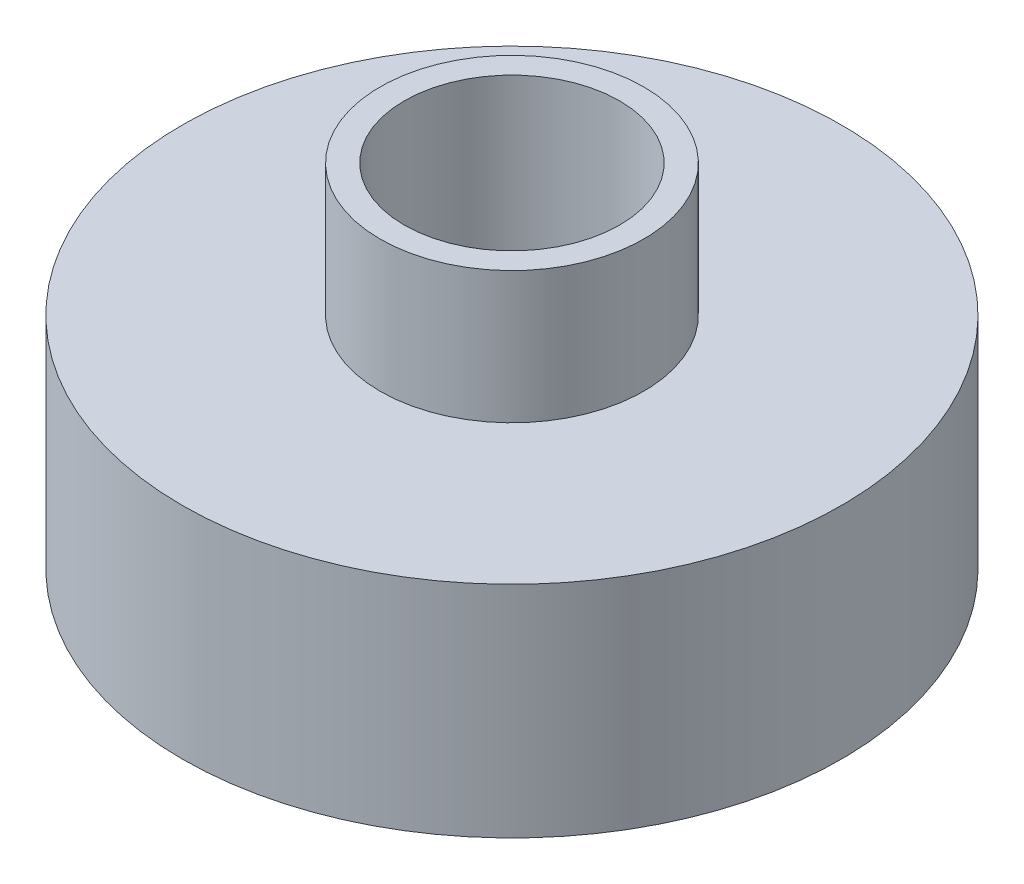
ISO-10303-21;
HEADER;
FILE_DESCRIPTION(('STEP AP214'),'2;1');
FILE_NAME('part.step','',(''),(''),'','','');
FILE_SCHEMA(('AUTOMOTIVE_DESIGN { 1 0 10303 214 1 1 1 1 }'));
ENDSEC;
DATA;
#1=APPLICATION_CONTEXT('core data for automotive mechanical design processes');
#2=APPLICATION_PROTOCOL_DEFINITION('international standard','automotive_design',2000,#1);
#3=PRODUCT_CONTEXT('',#1,'mechanical');
#4=PRODUCT('Part','Part','',(#3));
#5=PRODUCT_RELATED_PRODUCT_CATEGORY('part','',(#4));
#6=PRODUCT_DEFINITION_FORMATION('','',#4);
#7=PRODUCT_DEFINITION_CONTEXT('part definition',#1,'design');
#8=PRODUCT_DEFINITION('design','',#6,#7);
#9=PRODUCT_DEFINITION_SHAPE('','',#8);
#10=(LENGTH_UNIT() NAMED_UNIT(*) SI_UNIT(.MILLI.,.METRE.));
#11=(NAMED_UNIT(*) PLANE_ANGLE_UNIT() SI_UNIT($,.RADIAN.));
#12=(NAMED_UNIT(*) SI_UNIT($,.STERADIAN.) SOLID_ANGLE_UNIT());
#13=UNCERTAINTY_MEASURE_WITH_UNIT(LENGTH_MEASURE(1.E-05),#10,'distance_accuracy_value','');
#14=(GEOMETRIC_REPRESENTATION_CONTEXT(3) GLOBAL_UNCERTAINTY_ASSIGNED_CONTEXT((#13)) GLOBAL_UNIT_ASSIGNED_CONTEXT((#10,
#11,#12)) REPRESENTATION_CONTEXT('',''));
#15=CARTESIAN_POINT('',(0.,0.,0.));
#16=DIRECTION('',(0.,0.,1.));
#17=DIRECTION('',(1.,0.,0.));
#18=AXIS2_PLACEMENT_3D('',#15,#16,#17);
#19=CARTESIAN_POINT('',(0.,6.35,0.));
#20=DIRECTION('',(0.,-1.,0.));
#21=DIRECTION('',(0.,0.,-1.));
#22=AXIS2_PLACEMENT_3D('',#19,#20,#21);
#23=CYLINDRICAL_SURFACE('',#22,9.525);
#24=CARTESIAN_POINT('',(0.,6.35,0.));
#25=DIRECTION('',(0.,1.,0.));
#26=DIRECTION('',(0.,0.,1.));
#27=AXIS2_PLACEMENT_3D('',#24,#25,#26);
#28=CIRCLE('',#27,9.525);
#29=CARTESIAN_POINT('',(0.,6.35,9.525));
#30=VERTEX_POINT('',#29);
#31=EDGE_CURVE('E51',#30,#30,#28,.T.);
#32=ORIENTED_EDGE('',*,*,#31,.F.);
#33=EDGE_LOOP('',(#32));
#34=FACE_BOUND('',#33,.T.);
#35=CARTESIAN_POINT('',(0.,0.,0.));
#36=DIRECTION('',(0.,1.,0.));
#37=DIRECTION('',(0.,0.,1.));
#38=AXIS2_PLACEMENT_3D('',#35,#36,#37);
#39=CIRCLE('',#38,9.525);
#40=CARTESIAN_POINT('',(0.,0.,9.525));
#41=VERTEX_POINT('',#40);
#42=EDGE_CURVE('E46',#41,#41,#39,.T.);
#43=ORIENTED_EDGE('',*,*,#42,.T.);
#44=EDGE_LOOP('',(#43));
#45=FACE_BOUND('',#44,.T.);
#46=ADVANCED_FACE('F43',(#34,#45),#23,.T.);
#47=CARTESIAN_POINT('',(0.,6.35,0.));
#48=DIRECTION('',(0.,1.,0.));
#49=DIRECTION('',(0.,0.,1.));
#50=AXIS2_PLACEMENT_3D('',#47,#48,#49);
#51=PLANE('',#50);
#52=CARTESIAN_POINT('',(0.,6.35,0.));
#53=DIRECTION('',(0.,1.,0.));
#54=DIRECTION('',(0.,0.,1.));
#55=AXIS2_PLACEMENT_3D('',#52,#53,#54);
#56=CIRCLE('',#55,3.81);
#57=CARTESIAN_POINT('',(0.,6.35,-3.81));
#58=VERTEX_POINT('',#57);
#59=EDGE_CURVE('E10',#58,#58,#56,.T.);
#60=ORIENTED_EDGE('',*,*,#59,.F.);
#61=EDGE_LOOP('',(#60));
#62=FACE_BOUND('',#61,.T.);
#63=ORIENTED_EDGE('',*,*,#31,.T.);
#64=EDGE_LOOP('',(#63));
#65=FACE_BOUND('',#64,.T.);
#66=ADVANCED_FACE('F88',(#62,#65),#51,.T.);
#67=CARTESIAN_POINT('',(0.,0.,0.));
#68=DIRECTION('',(0.,1.,0.));
#69=DIRECTION('',(0.,0.,1.));
#70=AXIS2_PLACEMENT_3D('',#67,#68,#69);
#71=PLANE('',#70);
#72=CARTESIAN_POINT('',(0.,0.,0.));
#73=DIRECTION('',(0.,1.,0.));
#74=DIRECTION('',(0.,0.,1.));
#75=AXIS2_PLACEMENT_3D('',#72,#73,#74);
#76=CIRCLE('',#75,3.1115);
#77=CARTESIAN_POINT('',(0.,0.,3.1115));
#78=VERTEX_POINT('',#77);
#79=EDGE_CURVE('E62',#78,#78,#76,.T.);
#80=ORIENTED_EDGE('',*,*,#79,.T.);
#81=EDGE_LOOP('',(#80));
#82=FACE_BOUND('',#81,.T.);
#83=ORIENTED_EDGE('',*,*,#42,.F.);
#84=EDGE_LOOP('',(#83));
#85=FACE_BOUND('',#84,.T.);
#86=ADVANCED_FACE('F82',(#82,#85),#71,.F.);
#87=CARTESIAN_POINT('',(0.,10.16,0.));
#88=DIRECTION('',(0.,-1.,0.));
#89=DIRECTION('',(0.,0.,-1.));
#90=AXIS2_PLACEMENT_3D('',#87,#88,#89);
#91=CYLINDRICAL_SURFACE('',#90,3.81);
#92=CARTESIAN_POINT('',(0.,10.16,0.));
#93=DIRECTION('',(0.,1.,0.));
#94=DIRECTION('',(0.,0.,1.));
#95=AXIS2_PLACEMENT_3D('',#92,#93,#94);
#96=CIRCLE('',#95,3.81);
#97=CARTESIAN_POINT('',(0.,10.16,-3.81));
#98=VERTEX_POINT('',#97);
#99=EDGE_CURVE('E58',#98,#98,#96,.T.);
#100=CARTESIAN_POINT('',(0.,10.16,-3.81));
#101=CARTESIAN_POINT('',(0.,10.1203125,-3.81));
#102=CARTESIAN_POINT('',(0.,10.080625,-3.81));
#103=CARTESIAN_POINT('',(0.,10.00125,-3.81));
#104=CARTESIAN_POINT('',(0.,9.9615625,-3.81));
#105=CARTESIAN_POINT('',(0.,9.8821875,-3.81));
#106=CARTESIAN_POINT('',(0.,9.8425,-3.81));
#107=CARTESIAN_POINT('',(0.,9.763125,-3.81));
#108=CARTESIAN_POINT('',(0.,9.7234375,-3.81));
#109=CARTESIAN_POINT('',(0.,9.6440625,-3.81));
#110=CARTESIAN_POINT('',(0.,9.604375,-3.81));
#111=CARTESIAN_POINT('',(0.,9.525,-3.81));
#112=CARTESIAN_POINT('',(0.,9.4853125,-3.81));
#113=CARTESIAN_POINT('',(0.,9.4059375,-3.81));
#114=CARTESIAN_POINT('',(0.,9.36625,-3.81));
#115=CARTESIAN_POINT('',(0.,9.286875,-3.81));
#116=CARTESIAN_POINT('',(0.,9.2471875,-3.81));
#117=CARTESIAN_POINT('',(0.,9.1678125,-3.81));
#118=CARTESIAN_POINT('',(0.,9.128125,-3.81));
#119=CARTESIAN_POINT('',(0.,9.04875,-3.81));
#120=CARTESIAN_POINT('',(0.,9.0090625,-3.81));
#121=CARTESIAN_POINT('',(0.,8.9296875,-3.81));
#122=CARTESIAN_POINT('',(0.,8.89,-3.81));
#123=CARTESIAN_POINT('',(0.,8.810625,-3.81));
#124=CARTESIAN_POINT('',(0.,8.7709375,-3.81));
#125=CARTESIAN_POINT('',(0.,8.6915625,-3.81));
#126=CARTESIAN_POINT('',(0.,8.651875,-3.81));
#127=CARTESIAN_POINT('',(0.,8.5725,-3.81));
#128=CARTESIAN_POINT('',(0.,8.5328125,-3.81));
#129=CARTESIAN_POINT('',(0.,8.4534375,-3.81));
#130=CARTESIAN_POINT('',(0.,8.41375,-3.81));
#131=CARTESIAN_POINT('',(0.,8.334375,-3.81));
#132=CARTESIAN_POINT('',(0.,8.2946875,-3.81));
#133=CARTESIAN_POINT('',(0.,8.2153125,-3.81));
#134=CARTESIAN_POINT('',(0.,8.175625,-3.81));
#135=CARTESIAN_POINT('',(0.,8.09625,-3.81));
#136=CARTESIAN_POINT('',(0.,8.0565625,-3.81));
#137=CARTESIAN_POINT('',(0.,7.9771875,-3.81));
#138=CARTESIAN_POINT('',(0.,7.9375,-3.81));
#139=CARTESIAN_POINT('',(0.,7.858125,-3.81));
#140=CARTESIAN_POINT('',(0.,7.8184375,-3.81));
#141=CARTESIAN_POINT('',(0.,7.7390625,-3.81));
#142=CARTESIAN_POINT('',(0.,7.699375,-3.81));
#143=CARTESIAN_POINT('',(0.,7.62,-3.81));
#144=CARTESIAN_POINT('',(0.,7.5803125,-3.81));
#145=CARTESIAN_POINT('',(0.,7.5009375,-3.81));
#146=CARTESIAN_POINT('',(0.,7.46125,-3.81));
#147=CARTESIAN_POINT('',(0.,7.381875,-3.81));
#148=CARTESIAN_POINT('',(0.,7.3421875,-3.81));
#149=CARTESIAN_POINT('',(0.,7.2628125,-3.81));
#150=CARTESIAN_POINT('',(0.,7.223125,-3.81));
#151=CARTESIAN_POINT('',(0.,7.14375,-3.81));
#152=CARTESIAN_POINT('',(0.,7.1040625,-3.81));
#153=CARTESIAN_POINT('',(0.,7.0246875,-3.81));
#154=CARTESIAN_POINT('',(0.,6.985,-3.81));
#155=CARTESIAN_POINT('',(0.,6.905625,-3.81));
#156=CARTESIAN_POINT('',(0.,6.8659375,-3.81));
#157=CARTESIAN_POINT('',(0.,6.7865625,-3.81));
#158=CARTESIAN_POINT('',(0.,6.746875,-3.81));
#159=CARTESIAN_POINT('',(0.,6.6675,-3.81));
#160=CARTESIAN_POINT('',(0.,6.6278125,-3.81));
#161=CARTESIAN_POINT('',(0.,6.5484375,-3.81));
#162=CARTESIAN_POINT('',(0.,6.50875,-3.81));
#163=CARTESIAN_POINT('',(0.,6.429375,-3.81));
#164=CARTESIAN_POINT('',(0.,6.3896875,-3.81));
#165=CARTESIAN_POINT('',(0.,6.35,-3.81));
#166=B_SPLINE_CURVE_WITH_KNOTS('',3,(#100,#101,#102,#103,#104,#105,#106,#107,#108,#109,#110,
#111,#112,#113,#114,#115,#116,#117,#118,#119,#120,#121,#122,#123,#124,#125,#126,#127,#128,#129,
#130,#131,#132,#133,#134,#135,#136,#137,#138,#139,#140,#141,#142,#143,#144,#145,#146,#147,#148,
#149,#150,#151,#152,#153,#154,#155,#156,#157,#158,#159,#160,#161,#162,#163,#164,#165),
.UNSPECIFIED.,.F.,.F.,(4,2,2,2,2,2,2,2,2,2,2,2,2,2,2,2,2,2,2,2,2,2,2,2,2,2,2,2,2,2,2,2,4),(0.,
0.119062500000001,0.238125,0.357187500000002,0.476250000000001,0.5953125,0.714375,
0.833437500000001,0.9525,1.0715625,1.190625,1.3096875,1.42875,1.5478125,1.666875,1.7859375,
1.905,2.0240625,2.143125,2.2621875,2.38125,2.5003125,2.619375,2.7384375,2.8575,2.9765625,
3.095625,3.2146875,3.33375,3.4528125,3.571875,3.6909375,3.81),.UNSPECIFIED.);
#167=EDGE_CURVE('BSEAM77',#98,#58,#166,.T.);
#168=ORIENTED_EDGE('',*,*,#99,.F.);
#169=ORIENTED_EDGE('',*,*,#59,.T.);
#170=ORIENTED_EDGE('',*,*,#167,.T.);
#171=ORIENTED_EDGE('',*,*,#167,.F.);
#172=EDGE_LOOP('',(#168,#170,#169,#171));
#173=FACE_BOUND('',#172,.T.);
#174=ADVANCED_FACE('F77',(#173),#91,.T.);
#175=CARTESIAN_POINT('',(0.,10.16,0.));
#176=DIRECTION('',(0.,1.,0.));
#177=DIRECTION('',(0.,0.,1.));
#178=AXIS2_PLACEMENT_3D('',#175,#176,#177);
#179=PLANE('',#178);
#180=CARTESIAN_POINT('',(0.,10.16,0.));
#181=DIRECTION('',(0.,1.,0.));
#182=DIRECTION('',(0.,0.,1.));
#183=AXIS2_PLACEMENT_3D('',#180,#181,#182);
#184=CIRCLE('',#183,3.1115);
#185=CARTESIAN_POINT('',(0.,10.16,3.1115));
#186=VERTEX_POINT('',#185);
#187=EDGE_CURVE('E66',#186,#186,#184,.T.);
#188=ORIENTED_EDGE('',*,*,#187,.F.);
#189=EDGE_LOOP('',(#188));
#190=FACE_BOUND('',#189,.T.);
#191=ORIENTED_EDGE('',*,*,#99,.T.);
#192=EDGE_LOOP('',(#191));
#193=FACE_BOUND('',#192,.T.);
#194=ADVANCED_FACE('F74',(#190,#193),#179,.T.);
#195=CARTESIAN_POINT('',(0.,-3.81000000000001,0.));
#196=DIRECTION('',(0.,1.,0.));
#197=DIRECTION('',(0.,0.,1.));
#198=AXIS2_PLACEMENT_3D('',#195,#196,#197);
#199=CYLINDRICAL_SURFACE('',#198,3.1115);
#200=ORIENTED_EDGE('',*,*,#187,.T.);
#201=EDGE_LOOP('',(#200));
#202=FACE_BOUND('',#201,.T.);
#203=ORIENTED_EDGE('',*,*,#79,.F.);
#204=EDGE_LOOP('',(#203));
#205=FACE_BOUND('',#204,.T.);
#206=ADVANCED_FACE('F71',(#202,#205),#199,.F.);
#207=CLOSED_SHELL('',(#46,#66,#86,#174,#194,#206));
#208=MANIFOLD_SOLID_BREP('B2',#207);
#209=ADVANCED_BREP_SHAPE_REPRESENTATION('',(#18,#208),#14);
#210=SHAPE_DEFINITION_REPRESENTATION(#9,#209);
ENDSEC;
END-ISO-10303-21;
